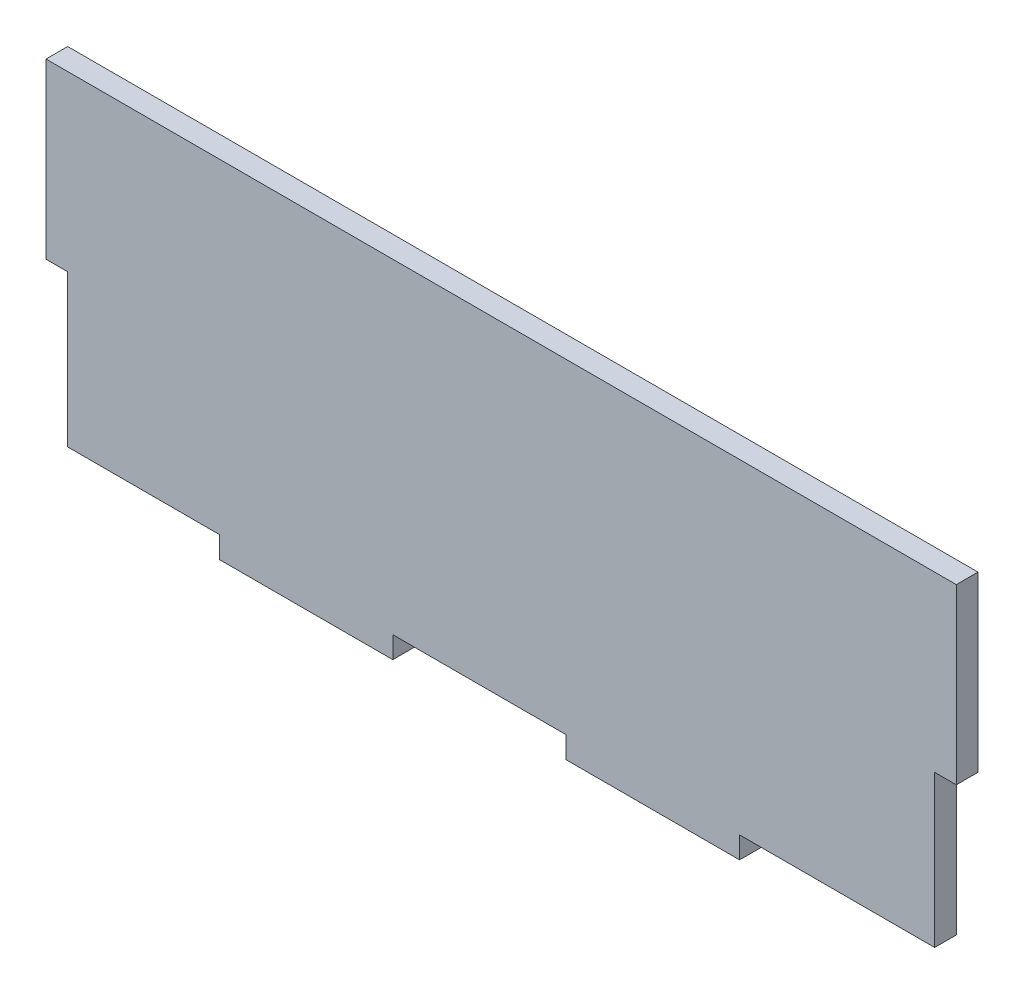
ISO-10303-21;
HEADER;
FILE_DESCRIPTION(('STEP AP214'),'2;1');
FILE_NAME('part.step','',(''),(''),'','','');
FILE_SCHEMA(('AUTOMOTIVE_DESIGN { 1 0 10303 214 1 1 1 1 }'));
ENDSEC;
DATA;
#1=APPLICATION_CONTEXT('core data for automotive mechanical design processes');
#2=APPLICATION_PROTOCOL_DEFINITION('international standard','automotive_design',2000,#1);
#3=PRODUCT_CONTEXT('',#1,'mechanical');
#4=PRODUCT('Part','Part','',(#3));
#5=PRODUCT_RELATED_PRODUCT_CATEGORY('part','',(#4));
#6=PRODUCT_DEFINITION_FORMATION('','',#4);
#7=PRODUCT_DEFINITION_CONTEXT('part definition',#1,'design');
#8=PRODUCT_DEFINITION('design','',#6,#7);
#9=PRODUCT_DEFINITION_SHAPE('','',#8);
#10=(LENGTH_UNIT() NAMED_UNIT(*) SI_UNIT(.MILLI.,.METRE.));
#11=(NAMED_UNIT(*) PLANE_ANGLE_UNIT() SI_UNIT($,.RADIAN.));
#12=(NAMED_UNIT(*) SI_UNIT($,.STERADIAN.) SOLID_ANGLE_UNIT());
#13=UNCERTAINTY_MEASURE_WITH_UNIT(LENGTH_MEASURE(1.E-05),#10,'distance_accuracy_value','');
#14=(GEOMETRIC_REPRESENTATION_CONTEXT(3) GLOBAL_UNCERTAINTY_ASSIGNED_CONTEXT((#13)) GLOBAL_UNIT_ASSIGNED_CONTEXT((#10,
#11,#12)) REPRESENTATION_CONTEXT('',''));
#15=CARTESIAN_POINT('',(0.,0.,0.));
#16=DIRECTION('',(0.,0.,1.));
#17=DIRECTION('',(1.,0.,0.));
#18=AXIS2_PLACEMENT_3D('',#15,#16,#17);
#19=CARTESIAN_POINT('',(266.7,50.8,6.35));
#20=DIRECTION('',(-1.,0.,0.));
#21=DIRECTION('',(0.,0.,1.));
#22=AXIS2_PLACEMENT_3D('',#19,#20,#21);
#23=PLANE('',#22);
#24=DIRECTION('',(0.,1.,0.));
#25=VECTOR('',#24,1.);
#26=CARTESIAN_POINT('',(266.7,50.8,0.));
#27=LINE('',#26,#25);
#28=CARTESIAN_POINT('',(266.7,50.8,0.));
#29=VERTEX_POINT('',#28);
#30=CARTESIAN_POINT('',(266.7,101.6,0.));
#31=VERTEX_POINT('',#30);
#32=EDGE_CURVE('E176',#29,#31,#27,.T.);
#33=ORIENTED_EDGE('',*,*,#32,.T.);
#34=DIRECTION('',(0.,0.,-1.));
#35=VECTOR('',#34,1.);
#36=CARTESIAN_POINT('',(266.7,101.6,6.35));
#37=LINE('',#36,#35);
#38=CARTESIAN_POINT('',(266.7,101.6,6.35));
#39=VERTEX_POINT('',#38);
#40=EDGE_CURVE('E11',#39,#31,#37,.T.);
#41=ORIENTED_EDGE('',*,*,#40,.F.);
#42=DIRECTION('',(0.,1.,0.));
#43=VECTOR('',#42,1.);
#44=CARTESIAN_POINT('',(266.7,50.8,6.35));
#45=LINE('',#44,#43);
#46=CARTESIAN_POINT('',(266.7,50.8,6.35));
#47=VERTEX_POINT('',#46);
#48=EDGE_CURVE('E207',#47,#39,#45,.T.);
#49=ORIENTED_EDGE('',*,*,#48,.F.);
#50=DIRECTION('',(0.,0.,-1.));
#51=VECTOR('',#50,1.);
#52=CARTESIAN_POINT('',(266.7,50.8,6.35));
#53=LINE('',#52,#51);
#54=EDGE_CURVE('E172',#47,#29,#53,.T.);
#55=ORIENTED_EDGE('',*,*,#54,.T.);
#56=EDGE_LOOP('',(#33,#41,#49,#55));
#57=FACE_BOUND('',#56,.T.);
#58=ADVANCED_FACE('F33',(#57),#23,.F.);
#59=CARTESIAN_POINT('',(0.,101.6,6.35));
#60=DIRECTION('',(0.,-1.,0.));
#61=DIRECTION('',(0.,0.,-1.));
#62=AXIS2_PLACEMENT_3D('',#59,#60,#61);
#63=PLANE('',#62);
#64=DIRECTION('',(-1.,0.,0.));
#65=VECTOR('',#64,1.);
#66=CARTESIAN_POINT('',(0.,101.6,0.));
#67=LINE('',#66,#65);
#68=CARTESIAN_POINT('',(0.,101.6,0.));
#69=VERTEX_POINT('',#68);
#70=EDGE_CURVE('E179',#31,#69,#67,.T.);
#71=ORIENTED_EDGE('',*,*,#70,.T.);
#72=DIRECTION('',(0.,0.,-1.));
#73=VECTOR('',#72,1.);
#74=CARTESIAN_POINT('',(0.,101.6,6.35));
#75=LINE('',#74,#73);
#76=CARTESIAN_POINT('',(0.,101.6,6.35));
#77=VERTEX_POINT('',#76);
#78=EDGE_CURVE('E41',#77,#69,#75,.T.);
#79=ORIENTED_EDGE('',*,*,#78,.F.);
#80=DIRECTION('',(-1.,0.,0.));
#81=VECTOR('',#80,1.);
#82=CARTESIAN_POINT('',(0.,101.6,6.35));
#83=LINE('',#82,#81);
#84=EDGE_CURVE('E116',#39,#77,#83,.T.);
#85=ORIENTED_EDGE('',*,*,#84,.F.);
#86=ORIENTED_EDGE('',*,*,#40,.T.);
#87=EDGE_LOOP('',(#71,#79,#85,#86));
#88=FACE_BOUND('',#87,.T.);
#89=ADVANCED_FACE('F306',(#88),#63,.F.);
#90=CARTESIAN_POINT('',(0.,101.6,6.35));
#91=DIRECTION('',(1.,0.,0.));
#92=DIRECTION('',(0.,1.,0.));
#93=AXIS2_PLACEMENT_3D('',#90,#91,#92);
#94=PLANE('',#93);
#95=DIRECTION('',(0.,-1.,0.));
#96=VECTOR('',#95,1.);
#97=CARTESIAN_POINT('',(0.,101.6,0.));
#98=LINE('',#97,#96);
#99=CARTESIAN_POINT('',(0.,50.8,0.));
#100=VERTEX_POINT('',#99);
#101=EDGE_CURVE('E181',#69,#100,#98,.T.);
#102=ORIENTED_EDGE('',*,*,#101,.T.);
#103=DIRECTION('',(0.,0.,-1.));
#104=VECTOR('',#103,1.);
#105=CARTESIAN_POINT('',(0.,50.8,6.35));
#106=LINE('',#105,#104);
#107=CARTESIAN_POINT('',(0.,50.8,6.35));
#108=VERTEX_POINT('',#107);
#109=EDGE_CURVE('E238',#108,#100,#106,.T.);
#110=ORIENTED_EDGE('',*,*,#109,.F.);
#111=DIRECTION('',(0.,-1.,0.));
#112=VECTOR('',#111,1.);
#113=CARTESIAN_POINT('',(0.,101.6,6.35));
#114=LINE('',#113,#112);
#115=EDGE_CURVE('E246',#77,#108,#114,.T.);
#116=ORIENTED_EDGE('',*,*,#115,.F.);
#117=ORIENTED_EDGE('',*,*,#78,.T.);
#118=EDGE_LOOP('',(#102,#110,#116,#117));
#119=FACE_BOUND('',#118,.T.);
#120=ADVANCED_FACE('F244',(#119),#94,.F.);
#121=CARTESIAN_POINT('',(0.,50.8,6.35));
#122=DIRECTION('',(0.,1.,0.));
#123=DIRECTION('',(0.,0.,1.));
#124=AXIS2_PLACEMENT_3D('',#121,#122,#123);
#125=PLANE('',#124);
#126=DIRECTION('',(1.,0.,0.));
#127=VECTOR('',#126,1.);
#128=CARTESIAN_POINT('',(0.,50.8,0.));
#129=LINE('',#128,#127);
#130=CARTESIAN_POINT('',(6.35000000000001,50.8,0.));
#131=VERTEX_POINT('',#130);
#132=EDGE_CURVE('E183',#100,#131,#129,.T.);
#133=ORIENTED_EDGE('',*,*,#132,.T.);
#134=DIRECTION('',(0.,0.,-1.));
#135=VECTOR('',#134,1.);
#136=CARTESIAN_POINT('',(6.35000000000001,50.8,6.35));
#137=LINE('',#136,#135);
#138=CARTESIAN_POINT('',(6.35000000000001,50.8,6.35));
#139=VERTEX_POINT('',#138);
#140=EDGE_CURVE('E235',#139,#131,#137,.T.);
#141=ORIENTED_EDGE('',*,*,#140,.F.);
#142=DIRECTION('',(1.,0.,0.));
#143=VECTOR('',#142,1.);
#144=CARTESIAN_POINT('',(0.,50.8,6.35));
#145=LINE('',#144,#143);
#146=EDGE_CURVE('E264',#108,#139,#145,.T.);
#147=ORIENTED_EDGE('',*,*,#146,.F.);
#148=ORIENTED_EDGE('',*,*,#109,.T.);
#149=EDGE_LOOP('',(#133,#141,#147,#148));
#150=FACE_BOUND('',#149,.T.);
#151=ADVANCED_FACE('F255',(#150),#125,.F.);
#152=CARTESIAN_POINT('',(6.35000000000001,50.8,6.35));
#153=DIRECTION('',(1.,0.,0.));
#154=DIRECTION('',(0.,0.,-1.));
#155=AXIS2_PLACEMENT_3D('',#152,#153,#154);
#156=PLANE('',#155);
#157=DIRECTION('',(0.,-1.,0.));
#158=VECTOR('',#157,1.);
#159=CARTESIAN_POINT('',(6.35000000000001,50.8,0.));
#160=LINE('',#159,#158);
#161=CARTESIAN_POINT('',(6.35000000000001,6.35,0.));
#162=VERTEX_POINT('',#161);
#163=EDGE_CURVE('E185',#131,#162,#160,.T.);
#164=ORIENTED_EDGE('',*,*,#163,.T.);
#165=DIRECTION('',(0.,0.,-1.));
#166=VECTOR('',#165,1.);
#167=CARTESIAN_POINT('',(6.35000000000001,6.35,6.35));
#168=LINE('',#167,#166);
#169=CARTESIAN_POINT('',(6.35000000000001,6.35,6.35));
#170=VERTEX_POINT('',#169);
#171=EDGE_CURVE('E232',#170,#162,#168,.T.);
#172=ORIENTED_EDGE('',*,*,#171,.F.);
#173=DIRECTION('',(0.,-1.,0.));
#174=VECTOR('',#173,1.);
#175=CARTESIAN_POINT('',(6.35000000000001,50.8,6.35));
#176=LINE('',#175,#174);
#177=EDGE_CURVE('E261',#139,#170,#176,.T.);
#178=ORIENTED_EDGE('',*,*,#177,.F.);
#179=ORIENTED_EDGE('',*,*,#140,.T.);
#180=EDGE_LOOP('',(#164,#172,#178,#179));
#181=FACE_BOUND('',#180,.T.);
#182=ADVANCED_FACE('F259',(#181),#156,.F.);
#183=CARTESIAN_POINT('',(6.35000000000001,6.35,6.35));
#184=DIRECTION('',(0.,1.,0.));
#185=DIRECTION('',(0.,0.,1.));
#186=AXIS2_PLACEMENT_3D('',#183,#184,#185);
#187=PLANE('',#186);
#188=DIRECTION('',(1.,0.,0.));
#189=VECTOR('',#188,1.);
#190=CARTESIAN_POINT('',(6.35000000000001,6.35,0.));
#191=LINE('',#190,#189);
#192=CARTESIAN_POINT('',(50.8,6.35,0.));
#193=VERTEX_POINT('',#192);
#194=EDGE_CURVE('E187',#162,#193,#191,.T.);
#195=ORIENTED_EDGE('',*,*,#194,.T.);
#196=DIRECTION('',(0.,0.,-1.));
#197=VECTOR('',#196,1.);
#198=CARTESIAN_POINT('',(50.8,6.35,6.35));
#199=LINE('',#198,#197);
#200=CARTESIAN_POINT('',(50.8,6.35,6.35));
#201=VERTEX_POINT('',#200);
#202=EDGE_CURVE('E229',#201,#193,#199,.T.);
#203=ORIENTED_EDGE('',*,*,#202,.F.);
#204=DIRECTION('',(1.,0.,0.));
#205=VECTOR('',#204,1.);
#206=CARTESIAN_POINT('',(6.35000000000001,6.35,6.35));
#207=LINE('',#206,#205);
#208=EDGE_CURVE('E263',#170,#201,#207,.T.);
#209=ORIENTED_EDGE('',*,*,#208,.F.);
#210=ORIENTED_EDGE('',*,*,#171,.T.);
#211=EDGE_LOOP('',(#195,#203,#209,#210));
#212=FACE_BOUND('',#211,.T.);
#213=ADVANCED_FACE('F319',(#212),#187,.F.);
#214=CARTESIAN_POINT('',(50.8,6.35,6.35));
#215=DIRECTION('',(1.,0.,0.));
#216=DIRECTION('',(0.,0.,-1.));
#217=AXIS2_PLACEMENT_3D('',#214,#215,#216);
#218=PLANE('',#217);
#219=DIRECTION('',(0.,-1.,0.));
#220=VECTOR('',#219,1.);
#221=CARTESIAN_POINT('',(50.8,6.35,0.));
#222=LINE('',#221,#220);
#223=CARTESIAN_POINT('',(50.8,0.,0.));
#224=VERTEX_POINT('',#223);
#225=EDGE_CURVE('E189',#193,#224,#222,.T.);
#226=ORIENTED_EDGE('',*,*,#225,.T.);
#227=DIRECTION('',(0.,0.,-1.));
#228=VECTOR('',#227,1.);
#229=CARTESIAN_POINT('',(50.8,0.,6.35));
#230=LINE('',#229,#228);
#231=CARTESIAN_POINT('',(50.8,0.,6.35));
#232=VERTEX_POINT('',#231);
#233=EDGE_CURVE('E226',#232,#224,#230,.T.);
#234=ORIENTED_EDGE('',*,*,#233,.F.);
#235=DIRECTION('',(0.,-1.,0.));
#236=VECTOR('',#235,1.);
#237=CARTESIAN_POINT('',(50.8,6.35,6.35));
#238=LINE('',#237,#236);
#239=EDGE_CURVE('E266',#201,#232,#238,.T.);
#240=ORIENTED_EDGE('',*,*,#239,.F.);
#241=ORIENTED_EDGE('',*,*,#202,.T.);
#242=EDGE_LOOP('',(#226,#234,#240,#241));
#243=FACE_BOUND('',#242,.T.);
#244=ADVANCED_FACE('F322',(#243),#218,.F.);
#245=CARTESIAN_POINT('',(50.8,0.,6.35));
#246=DIRECTION('',(0.,1.,0.));
#247=DIRECTION('',(0.,0.,1.));
#248=AXIS2_PLACEMENT_3D('',#245,#246,#247);
#249=PLANE('',#248);
#250=DIRECTION('',(1.,0.,0.));
#251=VECTOR('',#250,1.);
#252=CARTESIAN_POINT('',(50.8,0.,0.));
#253=LINE('',#252,#251);
#254=CARTESIAN_POINT('',(101.6,0.,0.));
#255=VERTEX_POINT('',#254);
#256=EDGE_CURVE('E191',#224,#255,#253,.T.);
#257=ORIENTED_EDGE('',*,*,#256,.T.);
#258=DIRECTION('',(0.,0.,-1.));
#259=VECTOR('',#258,1.);
#260=CARTESIAN_POINT('',(101.6,0.,6.35));
#261=LINE('',#260,#259);
#262=CARTESIAN_POINT('',(101.6,0.,6.35));
#263=VERTEX_POINT('',#262);
#264=EDGE_CURVE('E223',#263,#255,#261,.T.);
#265=ORIENTED_EDGE('',*,*,#264,.F.);
#266=DIRECTION('',(1.,0.,0.));
#267=VECTOR('',#266,1.);
#268=CARTESIAN_POINT('',(50.8,0.,6.35));
#269=LINE('',#268,#267);
#270=EDGE_CURVE('E272',#232,#263,#269,.T.);
#271=ORIENTED_EDGE('',*,*,#270,.F.);
#272=ORIENTED_EDGE('',*,*,#233,.T.);
#273=EDGE_LOOP('',(#257,#265,#271,#272));
#274=FACE_BOUND('',#273,.T.);
#275=ADVANCED_FACE('F326',(#274),#249,.F.);
#276=CARTESIAN_POINT('',(101.6,0.,6.35));
#277=DIRECTION('',(-1.,0.,0.));
#278=DIRECTION('',(0.,0.,1.));
#279=AXIS2_PLACEMENT_3D('',#276,#277,#278);
#280=PLANE('',#279);
#281=DIRECTION('',(0.,1.,0.));
#282=VECTOR('',#281,1.);
#283=CARTESIAN_POINT('',(101.6,0.,0.));
#284=LINE('',#283,#282);
#285=CARTESIAN_POINT('',(101.6,6.35,0.));
#286=VERTEX_POINT('',#285);
#287=EDGE_CURVE('E193',#255,#286,#284,.T.);
#288=ORIENTED_EDGE('',*,*,#287,.T.);
#289=DIRECTION('',(0.,0.,-1.));
#290=VECTOR('',#289,1.);
#291=CARTESIAN_POINT('',(101.6,6.35,6.35));
#292=LINE('',#291,#290);
#293=CARTESIAN_POINT('',(101.6,6.35,6.35));
#294=VERTEX_POINT('',#293);
#295=EDGE_CURVE('E220',#294,#286,#292,.T.);
#296=ORIENTED_EDGE('',*,*,#295,.F.);
#297=DIRECTION('',(0.,1.,0.));
#298=VECTOR('',#297,1.);
#299=CARTESIAN_POINT('',(101.6,0.,6.35));
#300=LINE('',#299,#298);
#301=EDGE_CURVE('E274',#263,#294,#300,.T.);
#302=ORIENTED_EDGE('',*,*,#301,.F.);
#303=ORIENTED_EDGE('',*,*,#264,.T.);
#304=EDGE_LOOP('',(#288,#296,#302,#303));
#305=FACE_BOUND('',#304,.T.);
#306=ADVANCED_FACE('F330',(#305),#280,.F.);
#307=CARTESIAN_POINT('',(101.6,6.35,6.35));
#308=DIRECTION('',(0.,1.,0.));
#309=DIRECTION('',(0.,0.,1.));
#310=AXIS2_PLACEMENT_3D('',#307,#308,#309);
#311=PLANE('',#310);
#312=DIRECTION('',(1.,0.,0.));
#313=VECTOR('',#312,1.);
#314=CARTESIAN_POINT('',(101.6,6.35,0.));
#315=LINE('',#314,#313);
#316=CARTESIAN_POINT('',(152.4,6.35,0.));
#317=VERTEX_POINT('',#316);
#318=EDGE_CURVE('E195',#286,#317,#315,.T.);
#319=ORIENTED_EDGE('',*,*,#318,.T.);
#320=DIRECTION('',(0.,0.,-1.));
#321=VECTOR('',#320,1.);
#322=CARTESIAN_POINT('',(152.4,6.35,6.35));
#323=LINE('',#322,#321);
#324=CARTESIAN_POINT('',(152.4,6.35,6.35));
#325=VERTEX_POINT('',#324);
#326=EDGE_CURVE('E217',#325,#317,#323,.T.);
#327=ORIENTED_EDGE('',*,*,#326,.F.);
#328=DIRECTION('',(1.,0.,0.));
#329=VECTOR('',#328,1.);
#330=CARTESIAN_POINT('',(101.6,6.35,6.35));
#331=LINE('',#330,#329);
#332=EDGE_CURVE('E276',#294,#325,#331,.T.);
#333=ORIENTED_EDGE('',*,*,#332,.F.);
#334=ORIENTED_EDGE('',*,*,#295,.T.);
#335=EDGE_LOOP('',(#319,#327,#333,#334));
#336=FACE_BOUND('',#335,.T.);
#337=ADVANCED_FACE('F334',(#336),#311,.F.);
#338=CARTESIAN_POINT('',(152.4,6.35,6.35));
#339=DIRECTION('',(1.,0.,0.));
#340=DIRECTION('',(0.,1.,0.));
#341=AXIS2_PLACEMENT_3D('',#338,#339,#340);
#342=PLANE('',#341);
#343=DIRECTION('',(0.,-1.,0.));
#344=VECTOR('',#343,1.);
#345=CARTESIAN_POINT('',(152.4,6.35,0.));
#346=LINE('',#345,#344);
#347=CARTESIAN_POINT('',(152.4,0.,0.));
#348=VERTEX_POINT('',#347);
#349=EDGE_CURVE('E197',#317,#348,#346,.T.);
#350=ORIENTED_EDGE('',*,*,#349,.T.);
#351=DIRECTION('',(0.,0.,-1.));
#352=VECTOR('',#351,1.);
#353=CARTESIAN_POINT('',(152.4,0.,6.35));
#354=LINE('',#353,#352);
#355=CARTESIAN_POINT('',(152.4,0.,6.35));
#356=VERTEX_POINT('',#355);
#357=EDGE_CURVE('E214',#356,#348,#354,.T.);
#358=ORIENTED_EDGE('',*,*,#357,.F.);
#359=DIRECTION('',(0.,-1.,0.));
#360=VECTOR('',#359,1.);
#361=CARTESIAN_POINT('',(152.4,6.35,6.35));
#362=LINE('',#361,#360);
#363=EDGE_CURVE('E278',#325,#356,#362,.T.);
#364=ORIENTED_EDGE('',*,*,#363,.F.);
#365=ORIENTED_EDGE('',*,*,#326,.T.);
#366=EDGE_LOOP('',(#350,#358,#364,#365));
#367=FACE_BOUND('',#366,.T.);
#368=ADVANCED_FACE('F338',(#367),#342,.F.);
#369=CARTESIAN_POINT('',(152.4,0.,6.35));
#370=DIRECTION('',(0.,1.,0.));
#371=DIRECTION('',(0.,0.,1.));
#372=AXIS2_PLACEMENT_3D('',#369,#370,#371);
#373=PLANE('',#372);
#374=DIRECTION('',(1.,0.,0.));
#375=VECTOR('',#374,1.);
#376=CARTESIAN_POINT('',(152.4,0.,0.));
#377=LINE('',#376,#375);
#378=CARTESIAN_POINT('',(203.2,0.,0.));
#379=VERTEX_POINT('',#378);
#380=EDGE_CURVE('E199',#348,#379,#377,.T.);
#381=ORIENTED_EDGE('',*,*,#380,.T.);
#382=DIRECTION('',(0.,0.,-1.));
#383=VECTOR('',#382,1.);
#384=CARTESIAN_POINT('',(203.2,0.,6.35));
#385=LINE('',#384,#383);
#386=CARTESIAN_POINT('',(203.2,0.,6.35));
#387=VERTEX_POINT('',#386);
#388=EDGE_CURVE('E211',#387,#379,#385,.T.);
#389=ORIENTED_EDGE('',*,*,#388,.F.);
#390=DIRECTION('',(1.,0.,0.));
#391=VECTOR('',#390,1.);
#392=CARTESIAN_POINT('',(152.4,0.,6.35));
#393=LINE('',#392,#391);
#394=EDGE_CURVE('E280',#356,#387,#393,.T.);
#395=ORIENTED_EDGE('',*,*,#394,.F.);
#396=ORIENTED_EDGE('',*,*,#357,.T.);
#397=EDGE_LOOP('',(#381,#389,#395,#396));
#398=FACE_BOUND('',#397,.T.);
#399=ADVANCED_FACE('F286',(#398),#373,.F.);
#400=CARTESIAN_POINT('',(203.2,0.,6.35));
#401=DIRECTION('',(-1.,0.,0.));
#402=DIRECTION('',(0.,0.,1.));
#403=AXIS2_PLACEMENT_3D('',#400,#401,#402);
#404=PLANE('',#403);
#405=DIRECTION('',(0.,1.,0.));
#406=VECTOR('',#405,1.);
#407=CARTESIAN_POINT('',(203.2,0.,0.));
#408=LINE('',#407,#406);
#409=CARTESIAN_POINT('',(203.2,6.35,0.));
#410=VERTEX_POINT('',#409);
#411=EDGE_CURVE('E201',#379,#410,#408,.T.);
#412=ORIENTED_EDGE('',*,*,#411,.T.);
#413=DIRECTION('',(0.,0.,-1.));
#414=VECTOR('',#413,1.);
#415=CARTESIAN_POINT('',(203.2,6.35,6.35));
#416=LINE('',#415,#414);
#417=CARTESIAN_POINT('',(203.2,6.35,6.35));
#418=VERTEX_POINT('',#417);
#419=EDGE_CURVE('E167',#418,#410,#416,.T.);
#420=ORIENTED_EDGE('',*,*,#419,.F.);
#421=DIRECTION('',(0.,1.,0.));
#422=VECTOR('',#421,1.);
#423=CARTESIAN_POINT('',(203.2,0.,6.35));
#424=LINE('',#423,#422);
#425=EDGE_CURVE('E159',#387,#418,#424,.T.);
#426=ORIENTED_EDGE('',*,*,#425,.F.);
#427=ORIENTED_EDGE('',*,*,#388,.T.);
#428=EDGE_LOOP('',(#412,#420,#426,#427));
#429=FACE_BOUND('',#428,.T.);
#430=ADVANCED_FACE('F290',(#429),#404,.F.);
#431=CARTESIAN_POINT('',(254.,6.35,6.35));
#432=DIRECTION('',(0.,1.,0.));
#433=DIRECTION('',(-1.,0.,0.));
#434=AXIS2_PLACEMENT_3D('',#431,#432,#433);
#435=PLANE('',#434);
#436=DIRECTION('',(1.,0.,0.));
#437=VECTOR('',#436,1.);
#438=CARTESIAN_POINT('',(254.,6.35,0.));
#439=LINE('',#438,#437);
#440=CARTESIAN_POINT('',(260.35,6.35,0.));
#441=VERTEX_POINT('',#440);
#442=EDGE_CURVE('E166',#410,#441,#439,.T.);
#443=ORIENTED_EDGE('',*,*,#442,.T.);
#444=DIRECTION('',(0.,0.,-1.));
#445=VECTOR('',#444,1.);
#446=CARTESIAN_POINT('',(260.35,6.35,6.35));
#447=LINE('',#446,#445);
#448=CARTESIAN_POINT('',(260.35,6.35,6.35));
#449=VERTEX_POINT('',#448);
#450=EDGE_CURVE('E164',#449,#441,#447,.T.);
#451=ORIENTED_EDGE('',*,*,#450,.F.);
#452=DIRECTION('',(1.,0.,0.));
#453=VECTOR('',#452,1.);
#454=CARTESIAN_POINT('',(203.2,6.35,6.35));
#455=LINE('',#454,#453);
#456=EDGE_CURVE('E153',#418,#449,#455,.T.);
#457=ORIENTED_EDGE('',*,*,#456,.F.);
#458=ORIENTED_EDGE('',*,*,#419,.T.);
#459=EDGE_LOOP('',(#443,#451,#457,#458));
#460=FACE_BOUND('',#459,.T.);
#461=ADVANCED_FACE('F165',(#460),#435,.F.);
#462=CARTESIAN_POINT('',(260.35,50.8,6.35));
#463=DIRECTION('',(-1.,0.,0.));
#464=DIRECTION('',(0.,0.,1.));
#465=AXIS2_PLACEMENT_3D('',#462,#463,#464);
#466=PLANE('',#465);
#467=DIRECTION('',(0.,1.,0.));
#468=VECTOR('',#467,1.);
#469=CARTESIAN_POINT('',(260.35,50.8,0.));
#470=LINE('',#469,#468);
#471=CARTESIAN_POINT('',(260.35,50.8,0.));
#472=VERTEX_POINT('',#471);
#473=EDGE_CURVE('E102',#441,#472,#470,.T.);
#474=ORIENTED_EDGE('',*,*,#473,.T.);
#475=DIRECTION('',(0.,0.,-1.));
#476=VECTOR('',#475,1.);
#477=CARTESIAN_POINT('',(260.35,50.8,6.35));
#478=LINE('',#477,#476);
#479=CARTESIAN_POINT('',(260.35,50.8,6.35));
#480=VERTEX_POINT('',#479);
#481=EDGE_CURVE('E168',#480,#472,#478,.T.);
#482=ORIENTED_EDGE('',*,*,#481,.F.);
#483=DIRECTION('',(0.,1.,0.));
#484=VECTOR('',#483,1.);
#485=CARTESIAN_POINT('',(260.35,50.8,6.35));
#486=LINE('',#485,#484);
#487=EDGE_CURVE('E157',#449,#480,#486,.T.);
#488=ORIENTED_EDGE('',*,*,#487,.F.);
#489=ORIENTED_EDGE('',*,*,#450,.T.);
#490=EDGE_LOOP('',(#474,#482,#488,#489));
#491=FACE_BOUND('',#490,.T.);
#492=ADVANCED_FACE('F170',(#491),#466,.F.);
#493=CARTESIAN_POINT('',(266.7,50.8,6.35));
#494=DIRECTION('',(0.,1.,0.));
#495=DIRECTION('',(-1.,0.,0.));
#496=AXIS2_PLACEMENT_3D('',#493,#494,#495);
#497=PLANE('',#496);
#498=DIRECTION('',(1.,0.,0.));
#499=VECTOR('',#498,1.);
#500=CARTESIAN_POINT('',(266.7,50.8,0.));
#501=LINE('',#500,#499);
#502=EDGE_CURVE('E108',#472,#29,#501,.T.);
#503=ORIENTED_EDGE('',*,*,#502,.T.);
#504=ORIENTED_EDGE('',*,*,#54,.F.);
#505=DIRECTION('',(1.,0.,0.));
#506=VECTOR('',#505,1.);
#507=CARTESIAN_POINT('',(266.7,50.8,6.35));
#508=LINE('',#507,#506);
#509=EDGE_CURVE('E49',#480,#47,#508,.T.);
#510=ORIENTED_EDGE('',*,*,#509,.F.);
#511=ORIENTED_EDGE('',*,*,#481,.T.);
#512=EDGE_LOOP('',(#503,#504,#510,#511));
#513=FACE_BOUND('',#512,.T.);
#514=ADVANCED_FACE('F295',(#513),#497,.F.);
#515=CARTESIAN_POINT('',(0.,0.,6.35));
#516=DIRECTION('',(0.,0.,-1.));
#517=DIRECTION('',(-1.,0.,0.));
#518=AXIS2_PLACEMENT_3D('',#515,#516,#517);
#519=PLANE('',#518);
#520=ORIENTED_EDGE('',*,*,#48,.T.);
#521=ORIENTED_EDGE('',*,*,#84,.T.);
#522=ORIENTED_EDGE('',*,*,#115,.T.);
#523=ORIENTED_EDGE('',*,*,#146,.T.);
#524=ORIENTED_EDGE('',*,*,#177,.T.);
#525=ORIENTED_EDGE('',*,*,#208,.T.);
#526=ORIENTED_EDGE('',*,*,#239,.T.);
#527=ORIENTED_EDGE('',*,*,#270,.T.);
#528=ORIENTED_EDGE('',*,*,#301,.T.);
#529=ORIENTED_EDGE('',*,*,#332,.T.);
#530=ORIENTED_EDGE('',*,*,#363,.T.);
#531=ORIENTED_EDGE('',*,*,#394,.T.);
#532=ORIENTED_EDGE('',*,*,#425,.T.);
#533=ORIENTED_EDGE('',*,*,#456,.T.);
#534=ORIENTED_EDGE('',*,*,#487,.T.);
#535=ORIENTED_EDGE('',*,*,#509,.T.);
#536=EDGE_LOOP('',(#520,#521,#522,#523,#524,#525,#526,#527,#528,#529,#530,#531,#532,#533,#534,#535));
#537=FACE_BOUND('',#536,.T.);
#538=ADVANCED_FACE('F155',(#537),#519,.F.);
#539=CARTESIAN_POINT('',(0.,0.,0.));
#540=DIRECTION('',(0.,0.,-1.));
#541=DIRECTION('',(-1.,0.,0.));
#542=AXIS2_PLACEMENT_3D('',#539,#540,#541);
#543=PLANE('',#542);
#544=ORIENTED_EDGE('',*,*,#32,.F.);
#545=ORIENTED_EDGE('',*,*,#502,.F.);
#546=ORIENTED_EDGE('',*,*,#473,.F.);
#547=ORIENTED_EDGE('',*,*,#442,.F.);
#548=ORIENTED_EDGE('',*,*,#411,.F.);
#549=ORIENTED_EDGE('',*,*,#380,.F.);
#550=ORIENTED_EDGE('',*,*,#349,.F.);
#551=ORIENTED_EDGE('',*,*,#318,.F.);
#552=ORIENTED_EDGE('',*,*,#287,.F.);
#553=ORIENTED_EDGE('',*,*,#256,.F.);
#554=ORIENTED_EDGE('',*,*,#225,.F.);
#555=ORIENTED_EDGE('',*,*,#194,.F.);
#556=ORIENTED_EDGE('',*,*,#163,.F.);
#557=ORIENTED_EDGE('',*,*,#132,.F.);
#558=ORIENTED_EDGE('',*,*,#101,.F.);
#559=ORIENTED_EDGE('',*,*,#70,.F.);
#560=EDGE_LOOP('',(#544,#545,#546,#547,#548,#549,#550,#551,#552,#553,#554,#555,#556,#557,#558,#559));
#561=FACE_BOUND('',#560,.T.);
#562=ADVANCED_FACE('F250',(#561),#543,.T.);
#563=CLOSED_SHELL('',(#58,#89,#120,#151,#182,#213,#244,#275,#306,#337,#368,#399,#430,#461,#492,
#514,#538,#562));
#564=MANIFOLD_SOLID_BREP('B2',#563);
#565=ADVANCED_BREP_SHAPE_REPRESENTATION('',(#18,#564),#14);
#566=SHAPE_DEFINITION_REPRESENTATION(#9,#565);
ENDSEC;
END-ISO-10303-21;
